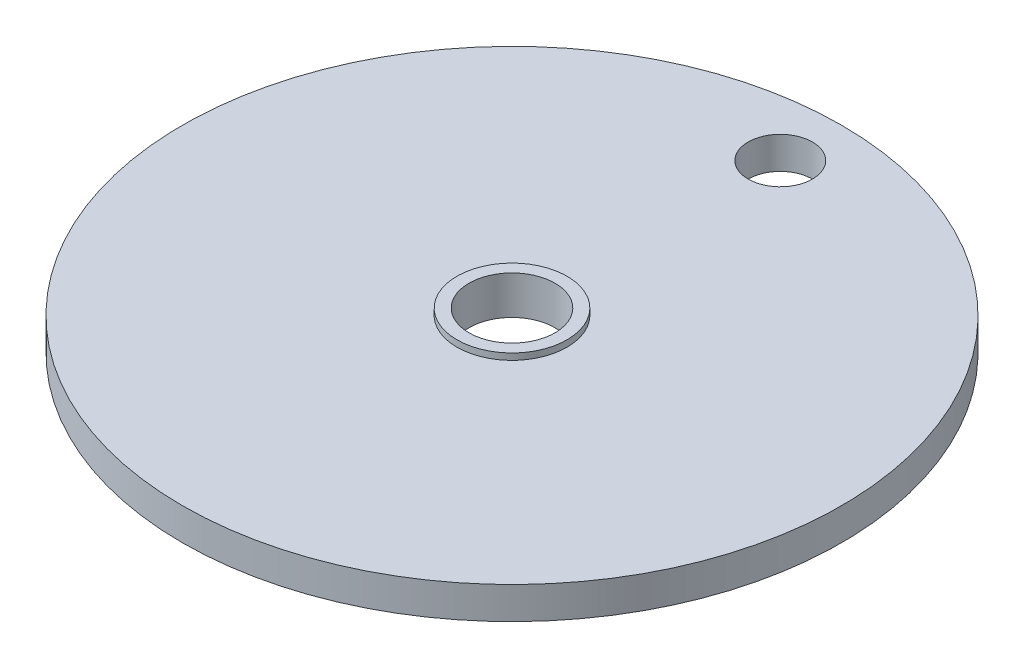
ISO-10303-21;
HEADER;
FILE_DESCRIPTION(('STEP AP214'),'2;1');
FILE_NAME('part.step','',(''),(''),'','','');
FILE_SCHEMA(('AUTOMOTIVE_DESIGN { 1 0 10303 214 1 1 1 1 }'));
ENDSEC;
DATA;
#1=APPLICATION_CONTEXT('core data for automotive mechanical design processes');
#2=APPLICATION_PROTOCOL_DEFINITION('international standard','automotive_design',2000,#1);
#3=PRODUCT_CONTEXT('',#1,'mechanical');
#4=PRODUCT('Part','Part','',(#3));
#5=PRODUCT_RELATED_PRODUCT_CATEGORY('part','',(#4));
#6=PRODUCT_DEFINITION_FORMATION('','',#4);
#7=PRODUCT_DEFINITION_CONTEXT('part definition',#1,'design');
#8=PRODUCT_DEFINITION('design','',#6,#7);
#9=PRODUCT_DEFINITION_SHAPE('','',#8);
#10=(LENGTH_UNIT() NAMED_UNIT(*) SI_UNIT(.MILLI.,.METRE.));
#11=(NAMED_UNIT(*) PLANE_ANGLE_UNIT() SI_UNIT($,.RADIAN.));
#12=(NAMED_UNIT(*) SI_UNIT($,.STERADIAN.) SOLID_ANGLE_UNIT());
#13=UNCERTAINTY_MEASURE_WITH_UNIT(LENGTH_MEASURE(1.E-05),#10,'distance_accuracy_value','');
#14=(GEOMETRIC_REPRESENTATION_CONTEXT(3) GLOBAL_UNCERTAINTY_ASSIGNED_CONTEXT((#13)) GLOBAL_UNIT_ASSIGNED_CONTEXT((#10,
#11,#12)) REPRESENTATION_CONTEXT('',''));
#15=CARTESIAN_POINT('',(0.,0.,0.));
#16=DIRECTION('',(0.,0.,1.));
#17=DIRECTION('',(1.,0.,0.));
#18=AXIS2_PLACEMENT_3D('',#15,#16,#17);
#19=CARTESIAN_POINT('',(0.,2.,0.));
#20=DIRECTION('',(0.,1.,0.));
#21=DIRECTION('',(0.,0.,1.));
#22=AXIS2_PLACEMENT_3D('',#19,#20,#21);
#23=PLANE('',#22);
#24=CARTESIAN_POINT('',(0.,2.,-16.6885908901946));
#25=DIRECTION('',(0.,1.,0.));
#26=DIRECTION('',(0.,0.,1.));
#27=AXIS2_PLACEMENT_3D('',#24,#25,#26);
#28=CIRCLE('',#27,2.);
#29=CARTESIAN_POINT('',(0.,2.,-14.6885908901946));
#30=VERTEX_POINT('',#29);
#31=EDGE_CURVE('E68',#30,#30,#28,.T.);
#32=ORIENTED_EDGE('',*,*,#31,.F.);
#33=EDGE_LOOP('',(#32));
#34=FACE_BOUND('',#33,.T.);
#35=CARTESIAN_POINT('',(0.,2.,0.));
#36=DIRECTION('',(0.,1.,0.));
#37=DIRECTION('',(0.,0.,1.));
#38=AXIS2_PLACEMENT_3D('',#35,#36,#37);
#39=CIRCLE('',#38,20.5);
#40=CARTESIAN_POINT('',(0.,2.,20.5));
#41=VERTEX_POINT('',#40);
#42=EDGE_CURVE('E10',#41,#41,#39,.T.);
#43=ORIENTED_EDGE('',*,*,#42,.T.);
#44=EDGE_LOOP('',(#43));
#45=FACE_BOUND('',#44,.T.);
#46=CARTESIAN_POINT('',(0.,2.,0.));
#47=DIRECTION('',(0.,1.,0.));
#48=DIRECTION('',(0.,0.,1.));
#49=AXIS2_PLACEMENT_3D('',#46,#47,#48);
#50=CIRCLE('',#49,3.425);
#51=CARTESIAN_POINT('',(0.,2.,3.425));
#52=VERTEX_POINT('',#51);
#53=EDGE_CURVE('E56',#52,#52,#50,.T.);
#54=ORIENTED_EDGE('',*,*,#53,.F.);
#55=EDGE_LOOP('',(#54));
#56=FACE_BOUND('',#55,.T.);
#57=ADVANCED_FACE('F37',(#34,#45,#56),#23,.T.);
#58=CARTESIAN_POINT('',(0.,2.,0.));
#59=DIRECTION('',(0.,-1.,0.));
#60=DIRECTION('',(0.,0.,-1.));
#61=AXIS2_PLACEMENT_3D('',#58,#59,#60);
#62=CYLINDRICAL_SURFACE('',#61,20.5);
#63=ORIENTED_EDGE('',*,*,#42,.F.);
#64=EDGE_LOOP('',(#63));
#65=FACE_BOUND('',#64,.T.);
#66=CARTESIAN_POINT('',(0.,0.,0.));
#67=DIRECTION('',(0.,1.,0.));
#68=DIRECTION('',(0.,0.,1.));
#69=AXIS2_PLACEMENT_3D('',#66,#67,#68);
#70=CIRCLE('',#69,20.5);
#71=CARTESIAN_POINT('',(0.,0.,20.5));
#72=VERTEX_POINT('',#71);
#73=EDGE_CURVE('E41',#72,#72,#70,.T.);
#74=ORIENTED_EDGE('',*,*,#73,.T.);
#75=EDGE_LOOP('',(#74));
#76=FACE_BOUND('',#75,.T.);
#77=ADVANCED_FACE('F39',(#65,#76),#62,.T.);
#78=CARTESIAN_POINT('',(0.,0.,0.));
#79=DIRECTION('',(0.,1.,0.));
#80=DIRECTION('',(0.,0.,1.));
#81=AXIS2_PLACEMENT_3D('',#78,#79,#80);
#82=PLANE('',#81);
#83=CARTESIAN_POINT('',(0.,0.,-16.6885908901946));
#84=DIRECTION('',(0.,1.,0.));
#85=DIRECTION('',(0.,0.,1.));
#86=AXIS2_PLACEMENT_3D('',#83,#84,#85);
#87=CIRCLE('',#86,2.);
#88=CARTESIAN_POINT('',(0.,0.,-14.6885908901946));
#89=VERTEX_POINT('',#88);
#90=EDGE_CURVE('E67',#89,#89,#87,.T.);
#91=ORIENTED_EDGE('',*,*,#90,.T.);
#92=EDGE_LOOP('',(#91));
#93=FACE_BOUND('',#92,.T.);
#94=CARTESIAN_POINT('',(0.,0.,0.));
#95=DIRECTION('',(0.,1.,0.));
#96=DIRECTION('',(0.,0.,1.));
#97=AXIS2_PLACEMENT_3D('',#94,#95,#96);
#98=CIRCLE('',#97,2.675);
#99=CARTESIAN_POINT('',(0.,0.,2.675));
#100=VERTEX_POINT('',#99);
#101=EDGE_CURVE('E50',#100,#100,#98,.T.);
#102=ORIENTED_EDGE('',*,*,#101,.T.);
#103=EDGE_LOOP('',(#102));
#104=FACE_BOUND('',#103,.T.);
#105=ORIENTED_EDGE('',*,*,#73,.F.);
#106=EDGE_LOOP('',(#105));
#107=FACE_BOUND('',#106,.T.);
#108=ADVANCED_FACE('F76',(#93,#104,#107),#82,.F.);
#109=CARTESIAN_POINT('',(0.,0.,0.));
#110=DIRECTION('',(0.,1.,0.));
#111=DIRECTION('',(0.,0.,1.));
#112=AXIS2_PLACEMENT_3D('',#109,#110,#111);
#113=CYLINDRICAL_SURFACE('',#112,2.675);
#114=ORIENTED_EDGE('',*,*,#101,.F.);
#115=EDGE_LOOP('',(#114));
#116=FACE_BOUND('',#115,.T.);
#117=CARTESIAN_POINT('',(0.,2.4,0.));
#118=DIRECTION('',(0.,1.,0.));
#119=DIRECTION('',(0.,0.,1.));
#120=AXIS2_PLACEMENT_3D('',#117,#118,#119);
#121=CIRCLE('',#120,2.675);
#122=CARTESIAN_POINT('',(0.,2.4,2.675));
#123=VERTEX_POINT('',#122);
#124=EDGE_CURVE('E60',#123,#123,#121,.T.);
#125=ORIENTED_EDGE('',*,*,#124,.T.);
#126=EDGE_LOOP('',(#125));
#127=FACE_BOUND('',#126,.T.);
#128=ADVANCED_FACE('F98',(#116,#127),#113,.F.);
#129=CARTESIAN_POINT('',(0.,2.4,0.));
#130=DIRECTION('',(0.,1.,0.));
#131=DIRECTION('',(0.,0.,1.));
#132=AXIS2_PLACEMENT_3D('',#129,#130,#131);
#133=PLANE('',#132);
#134=CARTESIAN_POINT('',(0.,2.4,0.));
#135=DIRECTION('',(0.,1.,0.));
#136=DIRECTION('',(0.,0.,1.));
#137=AXIS2_PLACEMENT_3D('',#134,#135,#136);
#138=CIRCLE('',#137,3.425);
#139=CARTESIAN_POINT('',(0.,2.4,3.425));
#140=VERTEX_POINT('',#139);
#141=EDGE_CURVE('E55',#140,#140,#138,.T.);
#142=ORIENTED_EDGE('',*,*,#141,.T.);
#143=EDGE_LOOP('',(#142));
#144=FACE_BOUND('',#143,.T.);
#145=ORIENTED_EDGE('',*,*,#124,.F.);
#146=EDGE_LOOP('',(#145));
#147=FACE_BOUND('',#146,.T.);
#148=ADVANCED_FACE('F92',(#144,#147),#133,.T.);
#149=CARTESIAN_POINT('',(0.,2.4,0.));
#150=DIRECTION('',(0.,-1.,0.));
#151=DIRECTION('',(0.,0.,-1.));
#152=AXIS2_PLACEMENT_3D('',#149,#150,#151);
#153=CYLINDRICAL_SURFACE('',#152,3.425);
#154=ORIENTED_EDGE('',*,*,#141,.F.);
#155=EDGE_LOOP('',(#154));
#156=FACE_BOUND('',#155,.T.);
#157=ORIENTED_EDGE('',*,*,#53,.T.);
#158=EDGE_LOOP('',(#157));
#159=FACE_BOUND('',#158,.T.);
#160=ADVANCED_FACE('F82',(#156,#159),#153,.T.);
#161=CARTESIAN_POINT('',(0.,0.,-16.6885908901946));
#162=DIRECTION('',(0.,1.,0.));
#163=DIRECTION('',(0.,0.,1.));
#164=AXIS2_PLACEMENT_3D('',#161,#162,#163);
#165=CYLINDRICAL_SURFACE('',#164,2.);
#166=ORIENTED_EDGE('',*,*,#90,.F.);
#167=EDGE_LOOP('',(#166));
#168=FACE_BOUND('',#167,.T.);
#169=ORIENTED_EDGE('',*,*,#31,.T.);
#170=EDGE_LOOP('',(#169));
#171=FACE_BOUND('',#170,.T.);
#172=ADVANCED_FACE('F79',(#168,#171),#165,.F.);
#173=CLOSED_SHELL('',(#57,#77,#108,#128,#148,#160,#172));
#174=MANIFOLD_SOLID_BREP('B2',#173);
#175=ADVANCED_BREP_SHAPE_REPRESENTATION('',(#18,#174),#14);
#176=SHAPE_DEFINITION_REPRESENTATION(#9,#175);
ENDSEC;
END-ISO-10303-21;
